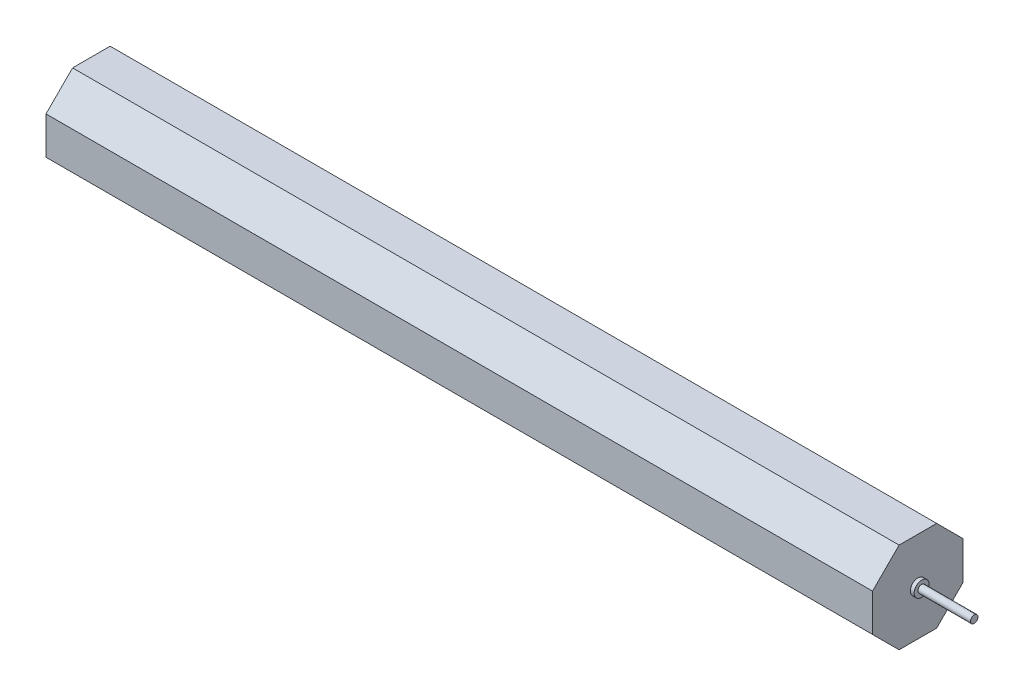
ISO-10303-21;
HEADER;
FILE_DESCRIPTION(('STEP AP214'),'2;1');
FILE_NAME('part.step','',(''),(''),'','','');
FILE_SCHEMA(('AUTOMOTIVE_DESIGN { 1 0 10303 214 1 1 1 1 }'));
ENDSEC;
DATA;
#1=APPLICATION_CONTEXT('core data for automotive mechanical design processes');
#2=APPLICATION_PROTOCOL_DEFINITION('international standard','automotive_design',2000,#1);
#3=PRODUCT_CONTEXT('',#1,'mechanical');
#4=PRODUCT('Part','Part','',(#3));
#5=PRODUCT_RELATED_PRODUCT_CATEGORY('part','',(#4));
#6=PRODUCT_DEFINITION_FORMATION('','',#4);
#7=PRODUCT_DEFINITION_CONTEXT('part definition',#1,'design');
#8=PRODUCT_DEFINITION('design','',#6,#7);
#9=PRODUCT_DEFINITION_SHAPE('','',#8);
#10=(LENGTH_UNIT() NAMED_UNIT(*) SI_UNIT(.MILLI.,.METRE.));
#11=(NAMED_UNIT(*) PLANE_ANGLE_UNIT() SI_UNIT($,.RADIAN.));
#12=(NAMED_UNIT(*) SI_UNIT($,.STERADIAN.) SOLID_ANGLE_UNIT());
#13=UNCERTAINTY_MEASURE_WITH_UNIT(LENGTH_MEASURE(1.E-05),#10,'distance_accuracy_value','');
#14=(GEOMETRIC_REPRESENTATION_CONTEXT(3) GLOBAL_UNCERTAINTY_ASSIGNED_CONTEXT((#13)) GLOBAL_UNIT_ASSIGNED_CONTEXT((#10,
#11,#12)) REPRESENTATION_CONTEXT('',''));
#15=CARTESIAN_POINT('',(0.,0.,0.));
#16=DIRECTION('',(0.,0.,1.));
#17=DIRECTION('',(1.,0.,0.));
#18=AXIS2_PLACEMENT_3D('',#15,#16,#17);
#19=CARTESIAN_POINT('',(220.,-12.0710678118655,-4.99999999999999));
#20=DIRECTION('',(0.,0.707106781186548,0.707106781186547));
#21=DIRECTION('',(0.,-0.707106781186547,0.707106781186548));
#22=AXIS2_PLACEMENT_3D('',#19,#20,#21);
#23=PLANE('',#22);
#24=DIRECTION('',(0.,0.707106781186547,-0.707106781186548));
#25=VECTOR('',#24,1.);
#26=CARTESIAN_POINT('',(0.,-12.0710678118655,-4.99999999999999));
#27=LINE('',#26,#25);
#28=CARTESIAN_POINT('',(0.,-12.0710678118655,-4.99999999999999));
#29=VERTEX_POINT('',#28);
#30=CARTESIAN_POINT('',(0.,-5.,-12.0710678118655));
#31=VERTEX_POINT('',#30);
#32=EDGE_CURVE('E139',#29,#31,#27,.T.);
#33=ORIENTED_EDGE('',*,*,#32,.T.);
#34=DIRECTION('',(-1.,0.,0.));
#35=VECTOR('',#34,1.);
#36=CARTESIAN_POINT('',(220.,-5.,-12.0710678118655));
#37=LINE('',#36,#35);
#38=CARTESIAN_POINT('',(220.,-5.,-12.0710678118655));
#39=VERTEX_POINT('',#38);
#40=EDGE_CURVE('E50',#39,#31,#37,.T.);
#41=ORIENTED_EDGE('',*,*,#40,.F.);
#42=DIRECTION('',(0.,0.707106781186547,-0.707106781186548));
#43=VECTOR('',#42,1.);
#44=CARTESIAN_POINT('',(220.,-12.0710678118655,-4.99999999999999));
#45=LINE('',#44,#43);
#46=CARTESIAN_POINT('',(220.,-12.0710678118655,-4.99999999999999));
#47=VERTEX_POINT('',#46);
#48=EDGE_CURVE('E154',#47,#39,#45,.T.);
#49=ORIENTED_EDGE('',*,*,#48,.F.);
#50=DIRECTION('',(-1.,0.,0.));
#51=VECTOR('',#50,1.);
#52=CARTESIAN_POINT('',(220.,-12.0710678118655,-4.99999999999999));
#53=LINE('',#52,#51);
#54=EDGE_CURVE('E135',#47,#29,#53,.T.);
#55=ORIENTED_EDGE('',*,*,#54,.T.);
#56=EDGE_LOOP('',(#33,#41,#49,#55));
#57=FACE_BOUND('',#56,.T.);
#58=ADVANCED_FACE('F42',(#57),#23,.F.);
#59=CARTESIAN_POINT('',(220.,-5.,-12.0710678118655));
#60=DIRECTION('',(0.,0.,1.));
#61=DIRECTION('',(0.,-1.,0.));
#62=AXIS2_PLACEMENT_3D('',#59,#60,#61);
#63=PLANE('',#62);
#64=DIRECTION('',(0.,1.,0.));
#65=VECTOR('',#64,1.);
#66=CARTESIAN_POINT('',(0.,-5.,-12.0710678118655));
#67=LINE('',#66,#65);
#68=CARTESIAN_POINT('',(0.,5.,-12.0710678118655));
#69=VERTEX_POINT('',#68);
#70=EDGE_CURVE('E142',#31,#69,#67,.T.);
#71=ORIENTED_EDGE('',*,*,#70,.T.);
#72=DIRECTION('',(-1.,0.,0.));
#73=VECTOR('',#72,1.);
#74=CARTESIAN_POINT('',(220.,5.,-12.0710678118655));
#75=LINE('',#74,#73);
#76=CARTESIAN_POINT('',(220.,5.,-12.0710678118655));
#77=VERTEX_POINT('',#76);
#78=EDGE_CURVE('E164',#77,#69,#75,.T.);
#79=ORIENTED_EDGE('',*,*,#78,.F.);
#80=DIRECTION('',(0.,1.,0.));
#81=VECTOR('',#80,1.);
#82=CARTESIAN_POINT('',(220.,-5.,-12.0710678118655));
#83=LINE('',#82,#81);
#84=EDGE_CURVE('E102',#39,#77,#83,.T.);
#85=ORIENTED_EDGE('',*,*,#84,.F.);
#86=ORIENTED_EDGE('',*,*,#40,.T.);
#87=EDGE_LOOP('',(#71,#79,#85,#86));
#88=FACE_BOUND('',#87,.T.);
#89=ADVANCED_FACE('F226',(#88),#63,.F.);
#90=CARTESIAN_POINT('',(220.,5.,-12.0710678118655));
#91=DIRECTION('',(0.,-0.707106781186547,0.707106781186548));
#92=DIRECTION('',(0.,-0.707106781186548,-0.707106781186547));
#93=AXIS2_PLACEMENT_3D('',#90,#91,#92);
#94=PLANE('',#93);
#95=DIRECTION('',(0.,0.707106781186548,0.707106781186547));
#96=VECTOR('',#95,1.);
#97=CARTESIAN_POINT('',(0.,5.,-12.0710678118655));
#98=LINE('',#97,#96);
#99=CARTESIAN_POINT('',(0.,12.0710678118655,-5.00000000000001));
#100=VERTEX_POINT('',#99);
#101=EDGE_CURVE('E145',#69,#100,#98,.T.);
#102=ORIENTED_EDGE('',*,*,#101,.T.);
#103=DIRECTION('',(-1.,0.,0.));
#104=VECTOR('',#103,1.);
#105=CARTESIAN_POINT('',(220.,12.0710678118655,-5.00000000000001));
#106=LINE('',#105,#104);
#107=CARTESIAN_POINT('',(220.,12.0710678118655,-5.00000000000001));
#108=VERTEX_POINT('',#107);
#109=EDGE_CURVE('E161',#108,#100,#106,.T.);
#110=ORIENTED_EDGE('',*,*,#109,.F.);
#111=DIRECTION('',(0.,0.707106781186548,0.707106781186547));
#112=VECTOR('',#111,1.);
#113=CARTESIAN_POINT('',(220.,5.,-12.0710678118655));
#114=LINE('',#113,#112);
#115=EDGE_CURVE('E193',#77,#108,#114,.T.);
#116=ORIENTED_EDGE('',*,*,#115,.F.);
#117=ORIENTED_EDGE('',*,*,#78,.T.);
#118=EDGE_LOOP('',(#102,#110,#116,#117));
#119=FACE_BOUND('',#118,.T.);
#120=ADVANCED_FACE('F230',(#119),#94,.F.);
#121=CARTESIAN_POINT('',(220.,12.0710678118655,-5.00000000000001));
#122=DIRECTION('',(0.,-1.,0.));
#123=DIRECTION('',(0.,0.,-1.));
#124=AXIS2_PLACEMENT_3D('',#121,#122,#123);
#125=PLANE('',#124);
#126=DIRECTION('',(0.,0.,1.));
#127=VECTOR('',#126,1.);
#128=CARTESIAN_POINT('',(0.,12.0710678118655,-5.00000000000001));
#129=LINE('',#128,#127);
#130=CARTESIAN_POINT('',(0.,12.0710678118655,5.));
#131=VERTEX_POINT('',#130);
#132=EDGE_CURVE('E147',#100,#131,#129,.T.);
#133=ORIENTED_EDGE('',*,*,#132,.T.);
#134=DIRECTION('',(-1.,0.,0.));
#135=VECTOR('',#134,1.);
#136=CARTESIAN_POINT('',(220.,12.0710678118655,5.));
#137=LINE('',#136,#135);
#138=CARTESIAN_POINT('',(220.,12.0710678118655,5.));
#139=VERTEX_POINT('',#138);
#140=EDGE_CURVE('E158',#139,#131,#137,.T.);
#141=ORIENTED_EDGE('',*,*,#140,.F.);
#142=DIRECTION('',(0.,0.,1.));
#143=VECTOR('',#142,1.);
#144=CARTESIAN_POINT('',(220.,12.0710678118655,-5.00000000000001));
#145=LINE('',#144,#143);
#146=EDGE_CURVE('E195',#108,#139,#145,.T.);
#147=ORIENTED_EDGE('',*,*,#146,.F.);
#148=ORIENTED_EDGE('',*,*,#109,.T.);
#149=EDGE_LOOP('',(#133,#141,#147,#148));
#150=FACE_BOUND('',#149,.T.);
#151=ADVANCED_FACE('F201',(#150),#125,.F.);
#152=CARTESIAN_POINT('',(220.,12.0710678118655,5.));
#153=DIRECTION('',(0.,-0.707106781186548,-0.707106781186547));
#154=DIRECTION('',(0.,0.707106781186547,-0.707106781186548));
#155=AXIS2_PLACEMENT_3D('',#152,#153,#154);
#156=PLANE('',#155);
#157=DIRECTION('',(0.,-0.707106781186547,0.707106781186548));
#158=VECTOR('',#157,1.);
#159=CARTESIAN_POINT('',(0.,12.0710678118655,5.));
#160=LINE('',#159,#158);
#161=CARTESIAN_POINT('',(0.,5.,12.0710678118655));
#162=VERTEX_POINT('',#161);
#163=EDGE_CURVE('E149',#131,#162,#160,.T.);
#164=ORIENTED_EDGE('',*,*,#163,.T.);
#165=DIRECTION('',(-1.,0.,0.));
#166=VECTOR('',#165,1.);
#167=CARTESIAN_POINT('',(220.,5.,12.0710678118655));
#168=LINE('',#167,#166);
#169=CARTESIAN_POINT('',(220.,5.,12.0710678118655));
#170=VERTEX_POINT('',#169);
#171=EDGE_CURVE('E130',#170,#162,#168,.T.);
#172=ORIENTED_EDGE('',*,*,#171,.F.);
#173=DIRECTION('',(0.,-0.707106781186547,0.707106781186548));
#174=VECTOR('',#173,1.);
#175=CARTESIAN_POINT('',(220.,12.0710678118655,5.));
#176=LINE('',#175,#174);
#177=EDGE_CURVE('E121',#139,#170,#176,.T.);
#178=ORIENTED_EDGE('',*,*,#177,.F.);
#179=ORIENTED_EDGE('',*,*,#140,.T.);
#180=EDGE_LOOP('',(#164,#172,#178,#179));
#181=FACE_BOUND('',#180,.T.);
#182=ADVANCED_FACE('F205',(#181),#156,.F.);
#183=CARTESIAN_POINT('',(220.,5.,12.0710678118655));
#184=DIRECTION('',(0.,0.,-1.));
#185=DIRECTION('',(-1.,0.,0.));
#186=AXIS2_PLACEMENT_3D('',#183,#184,#185);
#187=PLANE('',#186);
#188=DIRECTION('',(0.,-1.,0.));
#189=VECTOR('',#188,1.);
#190=CARTESIAN_POINT('',(0.,5.,12.0710678118655));
#191=LINE('',#190,#189);
#192=CARTESIAN_POINT('',(0.,-5.,12.0710678118655));
#193=VERTEX_POINT('',#192);
#194=EDGE_CURVE('E129',#162,#193,#191,.T.);
#195=ORIENTED_EDGE('',*,*,#194,.T.);
#196=DIRECTION('',(-1.,0.,0.));
#197=VECTOR('',#196,1.);
#198=CARTESIAN_POINT('',(220.,-5.,12.0710678118655));
#199=LINE('',#198,#197);
#200=CARTESIAN_POINT('',(220.,-5.,12.0710678118655));
#201=VERTEX_POINT('',#200);
#202=EDGE_CURVE('E126',#201,#193,#199,.T.);
#203=ORIENTED_EDGE('',*,*,#202,.F.);
#204=DIRECTION('',(0.,-1.,0.));
#205=VECTOR('',#204,1.);
#206=CARTESIAN_POINT('',(220.,5.,12.0710678118655));
#207=LINE('',#206,#205);
#208=EDGE_CURVE('E115',#170,#201,#207,.T.);
#209=ORIENTED_EDGE('',*,*,#208,.F.);
#210=ORIENTED_EDGE('',*,*,#171,.T.);
#211=EDGE_LOOP('',(#195,#203,#209,#210));
#212=FACE_BOUND('',#211,.T.);
#213=ADVANCED_FACE('F127',(#212),#187,.F.);
#214=CARTESIAN_POINT('',(220.,-5.,12.0710678118655));
#215=DIRECTION('',(0.,0.707106781186547,-0.707106781186548));
#216=DIRECTION('',(0.,0.707106781186548,0.707106781186547));
#217=AXIS2_PLACEMENT_3D('',#214,#215,#216);
#218=PLANE('',#217);
#219=DIRECTION('',(0.,-0.707106781186548,-0.707106781186547));
#220=VECTOR('',#219,1.);
#221=CARTESIAN_POINT('',(0.,-5.,12.0710678118655));
#222=LINE('',#221,#220);
#223=CARTESIAN_POINT('',(0.,-12.0710678118655,5.));
#224=VERTEX_POINT('',#223);
#225=EDGE_CURVE('E87',#193,#224,#222,.T.);
#226=ORIENTED_EDGE('',*,*,#225,.T.);
#227=DIRECTION('',(-1.,0.,0.));
#228=VECTOR('',#227,1.);
#229=CARTESIAN_POINT('',(220.,-12.0710678118655,5.));
#230=LINE('',#229,#228);
#231=CARTESIAN_POINT('',(220.,-12.0710678118655,5.));
#232=VERTEX_POINT('',#231);
#233=EDGE_CURVE('E131',#232,#224,#230,.T.);
#234=ORIENTED_EDGE('',*,*,#233,.F.);
#235=DIRECTION('',(0.,-0.707106781186548,-0.707106781186547));
#236=VECTOR('',#235,1.);
#237=CARTESIAN_POINT('',(220.,-5.,12.0710678118655));
#238=LINE('',#237,#236);
#239=EDGE_CURVE('E119',#201,#232,#238,.T.);
#240=ORIENTED_EDGE('',*,*,#239,.F.);
#241=ORIENTED_EDGE('',*,*,#202,.T.);
#242=EDGE_LOOP('',(#226,#234,#240,#241));
#243=FACE_BOUND('',#242,.T.);
#244=ADVANCED_FACE('F133',(#243),#218,.F.);
#245=CARTESIAN_POINT('',(220.,-12.0710678118655,5.));
#246=DIRECTION('',(0.,1.,0.));
#247=DIRECTION('',(0.,0.,1.));
#248=AXIS2_PLACEMENT_3D('',#245,#246,#247);
#249=PLANE('',#248);
#250=DIRECTION('',(0.,0.,-1.));
#251=VECTOR('',#250,1.);
#252=CARTESIAN_POINT('',(0.,-12.0710678118655,5.));
#253=LINE('',#252,#251);
#254=EDGE_CURVE('E93',#224,#29,#253,.T.);
#255=ORIENTED_EDGE('',*,*,#254,.T.);
#256=ORIENTED_EDGE('',*,*,#54,.F.);
#257=DIRECTION('',(0.,0.,-1.));
#258=VECTOR('',#257,1.);
#259=CARTESIAN_POINT('',(220.,-12.0710678118655,5.));
#260=LINE('',#259,#258);
#261=EDGE_CURVE('E58',#232,#47,#260,.T.);
#262=ORIENTED_EDGE('',*,*,#261,.F.);
#263=ORIENTED_EDGE('',*,*,#233,.T.);
#264=EDGE_LOOP('',(#255,#256,#262,#263));
#265=FACE_BOUND('',#264,.T.);
#266=ADVANCED_FACE('F213',(#265),#249,.F.);
#267=CARTESIAN_POINT('',(220.,0.,0.));
#268=DIRECTION('',(1.,0.,0.));
#269=DIRECTION('',(0.,0.,-1.));
#270=AXIS2_PLACEMENT_3D('',#267,#268,#269);
#271=PLANE('',#270);
#272=CARTESIAN_POINT('',(220.,0.,0.));
#273=DIRECTION('',(1.,0.,0.));
#274=DIRECTION('',(0.,0.,-1.));
#275=AXIS2_PLACEMENT_3D('',#272,#273,#274);
#276=CIRCLE('',#275,2.);
#277=CARTESIAN_POINT('',(220.,0.,-2.));
#278=VERTEX_POINT('',#277);
#279=EDGE_CURVE('E178',#278,#278,#276,.T.);
#280=ORIENTED_EDGE('',*,*,#279,.F.);
#281=EDGE_LOOP('',(#280));
#282=FACE_BOUND('',#281,.T.);
#283=ORIENTED_EDGE('',*,*,#48,.T.);
#284=ORIENTED_EDGE('',*,*,#84,.T.);
#285=ORIENTED_EDGE('',*,*,#115,.T.);
#286=ORIENTED_EDGE('',*,*,#146,.T.);
#287=ORIENTED_EDGE('',*,*,#177,.T.);
#288=ORIENTED_EDGE('',*,*,#208,.T.);
#289=ORIENTED_EDGE('',*,*,#239,.T.);
#290=ORIENTED_EDGE('',*,*,#261,.T.);
#291=EDGE_LOOP('',(#283,#284,#285,#286,#287,#288,#289,#290));
#292=FACE_BOUND('',#291,.T.);
#293=ADVANCED_FACE('F117',(#282,#292),#271,.T.);
#294=CARTESIAN_POINT('',(0.,0.,0.));
#295=DIRECTION('',(1.,0.,0.));
#296=DIRECTION('',(0.,0.,-1.));
#297=AXIS2_PLACEMENT_3D('',#294,#295,#296);
#298=PLANE('',#297);
#299=CARTESIAN_POINT('',(0.,0.,0.));
#300=DIRECTION('',(1.,0.,0.));
#301=DIRECTION('',(0.,0.,-1.));
#302=AXIS2_PLACEMENT_3D('',#299,#300,#301);
#303=CIRCLE('',#302,2.);
#304=CARTESIAN_POINT('',(0.,0.,-2.));
#305=VERTEX_POINT('',#304);
#306=EDGE_CURVE('E11',#305,#305,#303,.F.);
#307=ORIENTED_EDGE('',*,*,#306,.F.);
#308=EDGE_LOOP('',(#307));
#309=FACE_BOUND('',#308,.T.);
#310=ORIENTED_EDGE('',*,*,#32,.F.);
#311=ORIENTED_EDGE('',*,*,#254,.F.);
#312=ORIENTED_EDGE('',*,*,#225,.F.);
#313=ORIENTED_EDGE('',*,*,#194,.F.);
#314=ORIENTED_EDGE('',*,*,#163,.F.);
#315=ORIENTED_EDGE('',*,*,#132,.F.);
#316=ORIENTED_EDGE('',*,*,#101,.F.);
#317=ORIENTED_EDGE('',*,*,#70,.F.);
#318=EDGE_LOOP('',(#310,#311,#312,#313,#314,#315,#316,#317));
#319=FACE_BOUND('',#318,.T.);
#320=ADVANCED_FACE('F208',(#309,#319),#298,.F.);
#321=CARTESIAN_POINT('',(221.,0.,0.));
#322=DIRECTION('',(-1.,0.,0.));
#323=DIRECTION('',(0.,0.,1.));
#324=AXIS2_PLACEMENT_3D('',#321,#322,#323);
#325=CYLINDRICAL_SURFACE('',#324,2.);
#326=CARTESIAN_POINT('',(221.,0.,0.));
#327=DIRECTION('',(1.,0.,0.));
#328=DIRECTION('',(0.,0.,-1.));
#329=AXIS2_PLACEMENT_3D('',#326,#327,#328);
#330=CIRCLE('',#329,2.);
#331=CARTESIAN_POINT('',(221.,0.,-2.));
#332=VERTEX_POINT('',#331);
#333=EDGE_CURVE('E170',#332,#332,#330,.T.);
#334=ORIENTED_EDGE('',*,*,#333,.F.);
#335=EDGE_LOOP('',(#334));
#336=FACE_BOUND('',#335,.T.);
#337=ORIENTED_EDGE('',*,*,#279,.T.);
#338=EDGE_LOOP('',(#337));
#339=FACE_BOUND('',#338,.T.);
#340=ADVANCED_FACE('F272',(#336,#339),#325,.T.);
#341=CARTESIAN_POINT('',(221.,0.,0.));
#342=DIRECTION('',(1.,0.,0.));
#343=DIRECTION('',(0.,0.,-1.));
#344=AXIS2_PLACEMENT_3D('',#341,#342,#343);
#345=PLANE('',#344);
#346=CARTESIAN_POINT('',(221.,0.,0.));
#347=DIRECTION('',(1.,0.,0.));
#348=DIRECTION('',(0.,0.,-1.));
#349=AXIS2_PLACEMENT_3D('',#346,#347,#348);
#350=CIRCLE('',#349,1.);
#351=CARTESIAN_POINT('',(221.,0.,-1.));
#352=VERTEX_POINT('',#351);
#353=EDGE_CURVE('E168',#352,#352,#350,.T.);
#354=ORIENTED_EDGE('',*,*,#353,.F.);
#355=EDGE_LOOP('',(#354));
#356=FACE_BOUND('',#355,.T.);
#357=ORIENTED_EDGE('',*,*,#333,.T.);
#358=EDGE_LOOP('',(#357));
#359=FACE_BOUND('',#358,.T.);
#360=ADVANCED_FACE('F295',(#356,#359),#345,.T.);
#361=CARTESIAN_POINT('',(235.,0.,0.));
#362=DIRECTION('',(1.,0.,0.));
#363=DIRECTION('',(0.,0.,-1.));
#364=AXIS2_PLACEMENT_3D('',#361,#362,#363);
#365=PLANE('',#364);
#366=CARTESIAN_POINT('',(235.,0.,0.));
#367=DIRECTION('',(1.,0.,0.));
#368=DIRECTION('',(0.,0.,-1.));
#369=AXIS2_PLACEMENT_3D('',#366,#367,#368);
#370=CIRCLE('',#369,1.);
#371=CARTESIAN_POINT('',(235.,0.,-1.));
#372=VERTEX_POINT('',#371);
#373=EDGE_CURVE('E143',#372,#372,#370,.T.);
#374=ORIENTED_EDGE('',*,*,#373,.T.);
#375=EDGE_LOOP('',(#374));
#376=FACE_BOUND('',#375,.T.);
#377=ADVANCED_FACE('F285',(#376),#365,.T.);
#378=CARTESIAN_POINT('',(235.,0.,0.));
#379=DIRECTION('',(-1.,0.,0.));
#380=DIRECTION('',(0.,0.,1.));
#381=AXIS2_PLACEMENT_3D('',#378,#379,#380);
#382=CYLINDRICAL_SURFACE('',#381,1.);
#383=ORIENTED_EDGE('',*,*,#353,.T.);
#384=EDGE_LOOP('',(#383));
#385=FACE_BOUND('',#384,.T.);
#386=ORIENTED_EDGE('',*,*,#373,.F.);
#387=EDGE_LOOP('',(#386));
#388=FACE_BOUND('',#387,.T.);
#389=ADVANCED_FACE('F279',(#385,#388),#382,.T.);
#390=CARTESIAN_POINT('',(-1.,0.,0.));
#391=DIRECTION('',(1.,0.,0.));
#392=DIRECTION('',(0.,0.,-1.));
#393=AXIS2_PLACEMENT_3D('',#390,#391,#392);
#394=CYLINDRICAL_SURFACE('',#393,2.);
#395=CARTESIAN_POINT('',(-1.,0.,0.));
#396=DIRECTION('',(-1.,0.,0.));
#397=DIRECTION('',(0.,0.,1.));
#398=AXIS2_PLACEMENT_3D('',#395,#396,#397);
#399=CIRCLE('',#398,2.);
#400=CARTESIAN_POINT('',(-1.,0.,2.));
#401=VERTEX_POINT('',#400);
#402=EDGE_CURVE('E174',#401,#401,#399,.T.);
#403=ORIENTED_EDGE('',*,*,#402,.F.);
#404=EDGE_LOOP('',(#403));
#405=FACE_BOUND('',#404,.T.);
#406=ORIENTED_EDGE('',*,*,#306,.T.);
#407=EDGE_LOOP('',(#406));
#408=FACE_BOUND('',#407,.T.);
#409=ADVANCED_FACE('F284',(#405,#408),#394,.T.);
#410=CARTESIAN_POINT('',(-1.,0.,0.));
#411=DIRECTION('',(-1.,0.,0.));
#412=DIRECTION('',(0.,0.,1.));
#413=AXIS2_PLACEMENT_3D('',#410,#411,#412);
#414=PLANE('',#413);
#415=CARTESIAN_POINT('',(-1.,0.,0.));
#416=DIRECTION('',(-1.,0.,0.));
#417=DIRECTION('',(0.,0.,1.));
#418=AXIS2_PLACEMENT_3D('',#415,#416,#417);
#419=CIRCLE('',#418,1.);
#420=CARTESIAN_POINT('',(-1.,0.,1.));
#421=VERTEX_POINT('',#420);
#422=EDGE_CURVE('E171',#421,#421,#419,.T.);
#423=ORIENTED_EDGE('',*,*,#422,.F.);
#424=EDGE_LOOP('',(#423));
#425=FACE_BOUND('',#424,.T.);
#426=ORIENTED_EDGE('',*,*,#402,.T.);
#427=EDGE_LOOP('',(#426));
#428=FACE_BOUND('',#427,.T.);
#429=ADVANCED_FACE('F331',(#425,#428),#414,.T.);
#430=CARTESIAN_POINT('',(-5.,0.,0.));
#431=DIRECTION('',(-1.,0.,0.));
#432=DIRECTION('',(0.,0.,1.));
#433=AXIS2_PLACEMENT_3D('',#430,#431,#432);
#434=PLANE('',#433);
#435=CARTESIAN_POINT('',(-5.,0.,0.));
#436=DIRECTION('',(-1.,0.,0.));
#437=DIRECTION('',(0.,0.,1.));
#438=AXIS2_PLACEMENT_3D('',#435,#436,#437);
#439=CIRCLE('',#438,1.);
#440=CARTESIAN_POINT('',(-5.,0.,1.));
#441=VERTEX_POINT('',#440);
#442=EDGE_CURVE('E173',#441,#441,#439,.T.);
#443=ORIENTED_EDGE('',*,*,#442,.T.);
#444=EDGE_LOOP('',(#443));
#445=FACE_BOUND('',#444,.T.);
#446=ADVANCED_FACE('F322',(#445),#434,.T.);
#447=CARTESIAN_POINT('',(-5.,0.,0.));
#448=DIRECTION('',(1.,0.,0.));
#449=DIRECTION('',(0.,0.,-1.));
#450=AXIS2_PLACEMENT_3D('',#447,#448,#449);
#451=CYLINDRICAL_SURFACE('',#450,1.);
#452=ORIENTED_EDGE('',*,*,#422,.T.);
#453=EDGE_LOOP('',(#452));
#454=FACE_BOUND('',#453,.T.);
#455=ORIENTED_EDGE('',*,*,#442,.F.);
#456=EDGE_LOOP('',(#455));
#457=FACE_BOUND('',#456,.T.);
#458=ADVANCED_FACE('F317',(#454,#457),#451,.T.);
#459=CLOSED_SHELL('',(#58,#89,#120,#151,#182,#213,#244,#266,#293,#320,#340,#360,#377,#389,#409,
#429,#446,#458));
#460=MANIFOLD_SOLID_BREP('B2',#459);
#461=ADVANCED_BREP_SHAPE_REPRESENTATION('',(#18,#460),#14);
#462=SHAPE_DEFINITION_REPRESENTATION(#9,#461);
ENDSEC;
END-ISO-10303-21;
